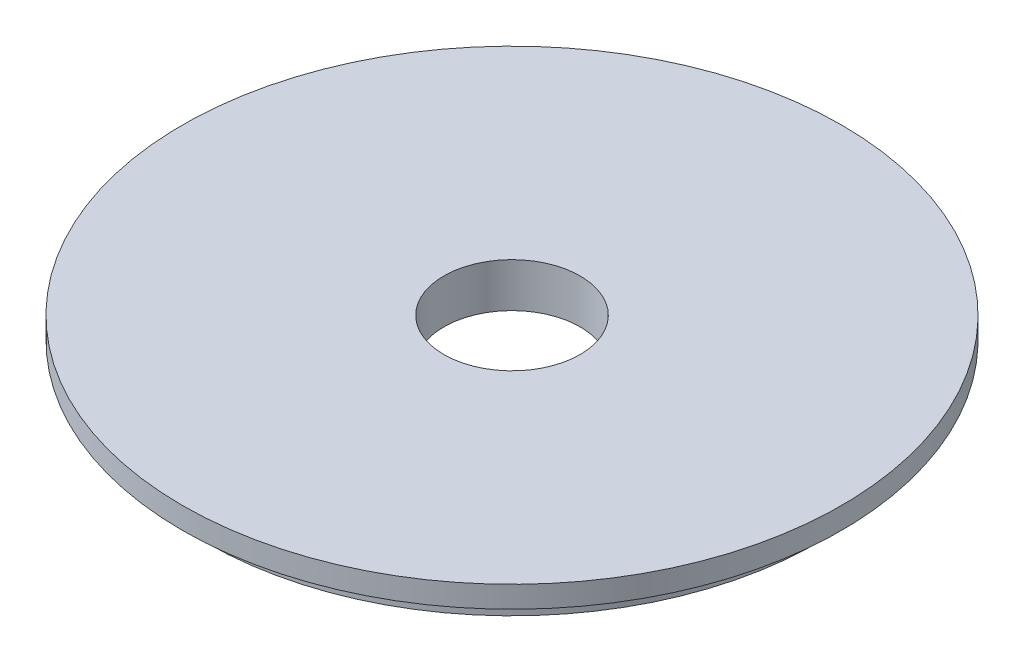
ISO-10303-21;
HEADER;
FILE_DESCRIPTION(('STEP AP214'),'2;1');
FILE_NAME('part.step','',(''),(''),'','','');
FILE_SCHEMA(('AUTOMOTIVE_DESIGN { 1 0 10303 214 1 1 1 1 }'));
ENDSEC;
DATA;
#1=APPLICATION_CONTEXT('core data for automotive mechanical design processes');
#2=APPLICATION_PROTOCOL_DEFINITION('international standard','automotive_design',2000,#1);
#3=PRODUCT_CONTEXT('',#1,'mechanical');
#4=PRODUCT('Part','Part','',(#3));
#5=PRODUCT_RELATED_PRODUCT_CATEGORY('part','',(#4));
#6=PRODUCT_DEFINITION_FORMATION('','',#4);
#7=PRODUCT_DEFINITION_CONTEXT('part definition',#1,'design');
#8=PRODUCT_DEFINITION('design','',#6,#7);
#9=PRODUCT_DEFINITION_SHAPE('','',#8);
#10=(LENGTH_UNIT() NAMED_UNIT(*) SI_UNIT(.MILLI.,.METRE.));
#11=(NAMED_UNIT(*) PLANE_ANGLE_UNIT() SI_UNIT($,.RADIAN.));
#12=(NAMED_UNIT(*) SI_UNIT($,.STERADIAN.) SOLID_ANGLE_UNIT());
#13=UNCERTAINTY_MEASURE_WITH_UNIT(LENGTH_MEASURE(1.E-05),#10,'distance_accuracy_value','');
#14=(GEOMETRIC_REPRESENTATION_CONTEXT(3) GLOBAL_UNCERTAINTY_ASSIGNED_CONTEXT((#13)) GLOBAL_UNIT_ASSIGNED_CONTEXT((#10,
#11,#12)) REPRESENTATION_CONTEXT('',''));
#15=CARTESIAN_POINT('',(0.,0.,0.));
#16=DIRECTION('',(0.,0.,1.));
#17=DIRECTION('',(1.,0.,0.));
#18=AXIS2_PLACEMENT_3D('',#15,#16,#17);
#19=CARTESIAN_POINT('',(0.,0.,0.));
#20=DIRECTION('',(0.,1.,0.));
#21=DIRECTION('',(0.,0.,1.));
#22=AXIS2_PLACEMENT_3D('',#19,#20,#21);
#23=CYLINDRICAL_SURFACE('',#22,9.525);
#24=CARTESIAN_POINT('',(0.,0.,0.));
#25=DIRECTION('',(0.,1.,0.));
#26=DIRECTION('',(0.,0.,1.));
#27=AXIS2_PLACEMENT_3D('',#24,#25,#26);
#28=CIRCLE('',#27,9.525);
#29=CARTESIAN_POINT('',(0.,0.,9.525));
#30=VERTEX_POINT('',#29);
#31=EDGE_CURVE('E10',#30,#30,#28,.T.);
#32=ORIENTED_EDGE('',*,*,#31,.T.);
#33=EDGE_LOOP('',(#32));
#34=FACE_BOUND('',#33,.T.);
#35=CARTESIAN_POINT('',(0.,-6.1722,0.));
#36=DIRECTION('',(0.,1.,0.));
#37=DIRECTION('',(0.,0.,1.));
#38=AXIS2_PLACEMENT_3D('',#35,#36,#37);
#39=CIRCLE('',#38,9.525);
#40=CARTESIAN_POINT('',(0.,-6.1722,9.525));
#41=VERTEX_POINT('',#40);
#42=EDGE_CURVE('E53',#41,#41,#39,.T.);
#43=ORIENTED_EDGE('',*,*,#42,.F.);
#44=EDGE_LOOP('',(#43));
#45=FACE_BOUND('',#44,.T.);
#46=ADVANCED_FACE('F31',(#34,#45),#23,.F.);
#47=CARTESIAN_POINT('',(-9.525,0.,0.));
#48=DIRECTION('',(0.,1.,0.));
#49=DIRECTION('',(0.,0.,1.));
#50=AXIS2_PLACEMENT_3D('',#47,#48,#49);
#51=PLANE('',#50);
#52=CARTESIAN_POINT('',(0.,0.,0.));
#53=DIRECTION('',(0.,1.,0.));
#54=DIRECTION('',(0.,0.,1.));
#55=AXIS2_PLACEMENT_3D('',#52,#53,#54);
#56=CIRCLE('',#55,46.0756);
#57=CARTESIAN_POINT('',(0.,0.,46.0756));
#58=VERTEX_POINT('',#57);
#59=EDGE_CURVE('E37',#58,#58,#56,.T.);
#60=ORIENTED_EDGE('',*,*,#59,.T.);
#61=EDGE_LOOP('',(#60));
#62=FACE_BOUND('',#61,.T.);
#63=ORIENTED_EDGE('',*,*,#31,.F.);
#64=EDGE_LOOP('',(#63));
#65=FACE_BOUND('',#64,.T.);
#66=ADVANCED_FACE('F61',(#62,#65),#51,.T.);
#67=CARTESIAN_POINT('',(0.,0.,0.));
#68=DIRECTION('',(0.,1.,0.));
#69=DIRECTION('',(0.,0.,1.));
#70=AXIS2_PLACEMENT_3D('',#67,#68,#69);
#71=CYLINDRICAL_SURFACE('',#70,46.0756);
#72=CARTESIAN_POINT('',(0.,-3.0226,0.));
#73=DIRECTION('',(0.,1.,0.));
#74=DIRECTION('',(0.,0.,1.));
#75=AXIS2_PLACEMENT_3D('',#72,#73,#74);
#76=CIRCLE('',#75,46.0756);
#77=CARTESIAN_POINT('',(0.,-3.0226,46.0756));
#78=VERTEX_POINT('',#77);
#79=EDGE_CURVE('E41',#78,#78,#76,.T.);
#80=ORIENTED_EDGE('',*,*,#79,.T.);
#81=EDGE_LOOP('',(#80));
#82=FACE_BOUND('',#81,.T.);
#83=ORIENTED_EDGE('',*,*,#59,.F.);
#84=EDGE_LOOP('',(#83));
#85=FACE_BOUND('',#84,.T.);
#86=ADVANCED_FACE('F65',(#82,#85),#71,.T.);
#87=CARTESIAN_POINT('',(-46.0756,-3.0226,0.));
#88=DIRECTION('',(0.,-1.,0.));
#89=DIRECTION('',(0.,0.,-1.));
#90=AXIS2_PLACEMENT_3D('',#87,#88,#89);
#91=PLANE('',#90);
#92=CARTESIAN_POINT('',(0.,-3.0226,0.));
#93=DIRECTION('',(0.,1.,0.));
#94=DIRECTION('',(0.,0.,1.));
#95=AXIS2_PLACEMENT_3D('',#92,#93,#94);
#96=CIRCLE('',#95,42.7482);
#97=CARTESIAN_POINT('',(0.,-3.0226,42.7482));
#98=VERTEX_POINT('',#97);
#99=EDGE_CURVE('E45',#98,#98,#96,.T.);
#100=ORIENTED_EDGE('',*,*,#99,.T.);
#101=EDGE_LOOP('',(#100));
#102=FACE_BOUND('',#101,.T.);
#103=ORIENTED_EDGE('',*,*,#79,.F.);
#104=EDGE_LOOP('',(#103));
#105=FACE_BOUND('',#104,.T.);
#106=ADVANCED_FACE('F69',(#102,#105),#91,.T.);
#107=CARTESIAN_POINT('',(0.,0.,0.));
#108=DIRECTION('',(0.,1.,0.));
#109=DIRECTION('',(0.,0.,1.));
#110=AXIS2_PLACEMENT_3D('',#107,#108,#109);
#111=CYLINDRICAL_SURFACE('',#110,42.7482);
#112=CARTESIAN_POINT('',(0.,-6.1722,0.));
#113=DIRECTION('',(0.,1.,0.));
#114=DIRECTION('',(0.,0.,1.));
#115=AXIS2_PLACEMENT_3D('',#112,#113,#114);
#116=CIRCLE('',#115,42.7482);
#117=CARTESIAN_POINT('',(0.,-6.1722,42.7482));
#118=VERTEX_POINT('',#117);
#119=EDGE_CURVE('E50',#118,#118,#116,.T.);
#120=ORIENTED_EDGE('',*,*,#119,.T.);
#121=EDGE_LOOP('',(#120));
#122=FACE_BOUND('',#121,.T.);
#123=ORIENTED_EDGE('',*,*,#99,.F.);
#124=EDGE_LOOP('',(#123));
#125=FACE_BOUND('',#124,.T.);
#126=ADVANCED_FACE('F76',(#122,#125),#111,.T.);
#127=CARTESIAN_POINT('',(-42.7482,-6.1722,0.));
#128=DIRECTION('',(0.,-1.,0.));
#129=DIRECTION('',(0.,0.,-1.));
#130=AXIS2_PLACEMENT_3D('',#127,#128,#129);
#131=PLANE('',#130);
#132=ORIENTED_EDGE('',*,*,#42,.T.);
#133=EDGE_LOOP('',(#132));
#134=FACE_BOUND('',#133,.T.);
#135=ORIENTED_EDGE('',*,*,#119,.F.);
#136=EDGE_LOOP('',(#135));
#137=FACE_BOUND('',#136,.T.);
#138=ADVANCED_FACE('F57',(#134,#137),#131,.T.);
#139=CLOSED_SHELL('',(#46,#66,#86,#106,#126,#138));
#140=MANIFOLD_SOLID_BREP('B2',#139);
#141=ADVANCED_BREP_SHAPE_REPRESENTATION('',(#18,#140),#14);
#142=SHAPE_DEFINITION_REPRESENTATION(#9,#141);
ENDSEC;
END-ISO-10303-21;
